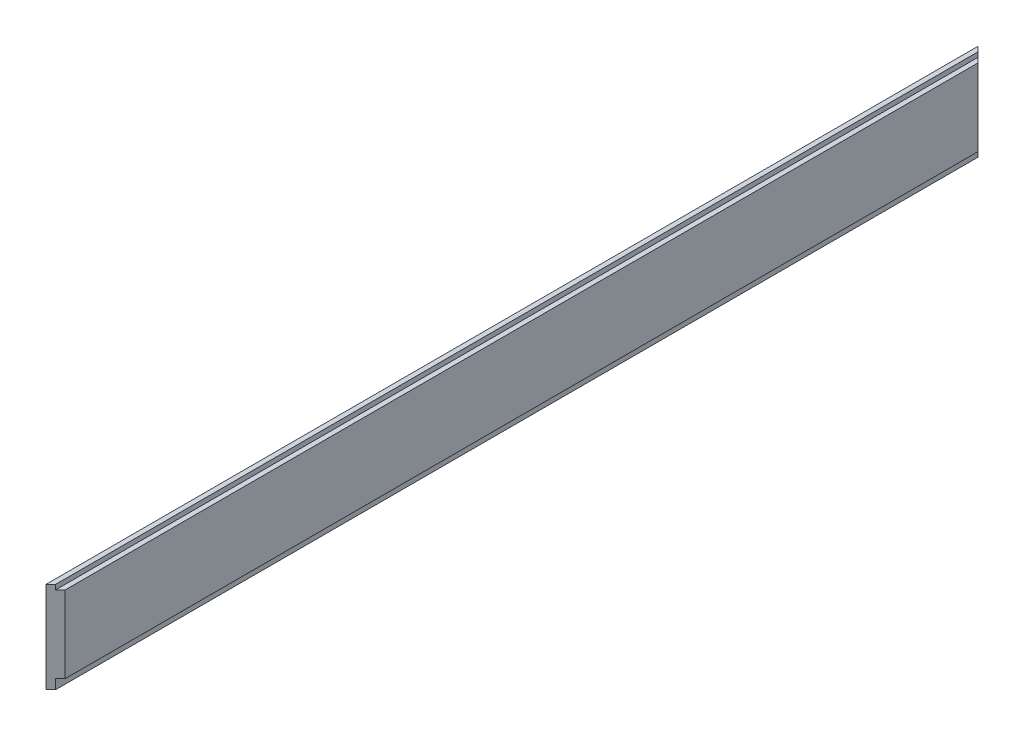
ISO-10303-21;
HEADER;
FILE_DESCRIPTION(('STEP AP214'),'2;1');
FILE_NAME('part.step','',(''),(''),'','','');
FILE_SCHEMA(('AUTOMOTIVE_DESIGN { 1 0 10303 214 1 1 1 1 }'));
ENDSEC;
DATA;
#1=APPLICATION_CONTEXT('core data for automotive mechanical design processes');
#2=APPLICATION_PROTOCOL_DEFINITION('international standard','automotive_design',2000,#1);
#3=PRODUCT_CONTEXT('',#1,'mechanical');
#4=PRODUCT('Part','Part','',(#3));
#5=PRODUCT_RELATED_PRODUCT_CATEGORY('part','',(#4));
#6=PRODUCT_DEFINITION_FORMATION('','',#4);
#7=PRODUCT_DEFINITION_CONTEXT('part definition',#1,'design');
#8=PRODUCT_DEFINITION('design','',#6,#7);
#9=PRODUCT_DEFINITION_SHAPE('','',#8);
#10=(LENGTH_UNIT() NAMED_UNIT(*) SI_UNIT(.MILLI.,.METRE.));
#11=(NAMED_UNIT(*) PLANE_ANGLE_UNIT() SI_UNIT($,.RADIAN.));
#12=(NAMED_UNIT(*) SI_UNIT($,.STERADIAN.) SOLID_ANGLE_UNIT());
#13=UNCERTAINTY_MEASURE_WITH_UNIT(LENGTH_MEASURE(1.E-05),#10,'distance_accuracy_value','');
#14=(GEOMETRIC_REPRESENTATION_CONTEXT(3) GLOBAL_UNCERTAINTY_ASSIGNED_CONTEXT((#13)) GLOBAL_UNIT_ASSIGNED_CONTEXT((#10,
#11,#12)) REPRESENTATION_CONTEXT('',''));
#15=CARTESIAN_POINT('',(0.,0.,0.));
#16=DIRECTION('',(0.,0.,1.));
#17=DIRECTION('',(1.,0.,0.));
#18=AXIS2_PLACEMENT_3D('',#15,#16,#17);
#19=CARTESIAN_POINT('',(3.175,0.,615.95));
#20=DIRECTION('',(0.,-1.,0.));
#21=DIRECTION('',(1.,0.,0.));
#22=AXIS2_PLACEMENT_3D('',#19,#20,#21);
#23=PLANE('',#22);
#24=DIRECTION('',(0.,0.,-1.));
#25=VECTOR('',#24,1.);
#26=CARTESIAN_POINT('',(3.175,0.,615.95));
#27=LINE('',#26,#25);
#28=CARTESIAN_POINT('',(3.175,0.,612.775));
#29=VERTEX_POINT('',#28);
#30=CARTESIAN_POINT('',(3.17499999999998,0.,3.17499999999995));
#31=VERTEX_POINT('',#30);
#32=EDGE_CURVE('E11',#29,#31,#27,.T.);
#33=ORIENTED_EDGE('',*,*,#32,.F.);
#34=DIRECTION('',(0.707106781186547,0.,-0.707106781186548));
#35=VECTOR('',#34,1.);
#36=CARTESIAN_POINT('',(6.34999999999999,0.,609.6));
#37=LINE('',#36,#35);
#38=CARTESIAN_POINT('',(0.,0.,615.95));
#39=VERTEX_POINT('',#38);
#40=EDGE_CURVE('E99',#39,#29,#37,.T.);
#41=ORIENTED_EDGE('',*,*,#40,.F.);
#42=DIRECTION('',(0.,0.,-1.));
#43=VECTOR('',#42,1.);
#44=CARTESIAN_POINT('',(0.,0.,615.95));
#45=LINE('',#44,#43);
#46=CARTESIAN_POINT('',(0.,0.,0.));
#47=VERTEX_POINT('',#46);
#48=EDGE_CURVE('E40',#39,#47,#45,.T.);
#49=ORIENTED_EDGE('',*,*,#48,.T.);
#50=DIRECTION('',(0.707106781186547,0.,0.707106781186548));
#51=VECTOR('',#50,1.);
#52=CARTESIAN_POINT('',(6.34999999999999,0.,6.35));
#53=LINE('',#52,#51);
#54=EDGE_CURVE('E141',#47,#31,#53,.T.);
#55=ORIENTED_EDGE('',*,*,#54,.T.);
#56=EDGE_LOOP('',(#33,#41,#49,#55));
#57=FACE_BOUND('',#56,.T.);
#58=ADVANCED_FACE('F37',(#57),#23,.T.);
#59=CARTESIAN_POINT('',(3.175,6.35,615.95));
#60=DIRECTION('',(1.,0.,0.));
#61=DIRECTION('',(0.,1.,0.));
#62=AXIS2_PLACEMENT_3D('',#59,#60,#61);
#63=PLANE('',#62);
#64=DIRECTION('',(0.,0.,-1.));
#65=VECTOR('',#64,1.);
#66=CARTESIAN_POINT('',(3.175,6.35,615.95));
#67=LINE('',#66,#65);
#68=CARTESIAN_POINT('',(3.175,6.35,612.775));
#69=VERTEX_POINT('',#68);
#70=CARTESIAN_POINT('',(3.17500000000004,6.35,3.17499999999998));
#71=VERTEX_POINT('',#70);
#72=EDGE_CURVE('E46',#69,#71,#67,.T.);
#73=ORIENTED_EDGE('',*,*,#72,.F.);
#74=DIRECTION('',(0.,-1.,0.));
#75=VECTOR('',#74,1.);
#76=CARTESIAN_POINT('',(3.175,6.35,612.775));
#77=LINE('',#76,#75);
#78=EDGE_CURVE('E145',#69,#29,#77,.T.);
#79=ORIENTED_EDGE('',*,*,#78,.T.);
#80=ORIENTED_EDGE('',*,*,#32,.T.);
#81=DIRECTION('',(0.,-1.,0.));
#82=VECTOR('',#81,1.);
#83=CARTESIAN_POINT('',(3.175,6.34999999999996,3.17499999999993));
#84=LINE('',#83,#82);
#85=EDGE_CURVE('E125',#71,#31,#84,.T.);
#86=ORIENTED_EDGE('',*,*,#85,.F.);
#87=EDGE_LOOP('',(#73,#79,#80,#86));
#88=FACE_BOUND('',#87,.T.);
#89=ADVANCED_FACE('F183',(#88),#63,.T.);
#90=CARTESIAN_POINT('',(6.35,6.35,615.95));
#91=DIRECTION('',(0.,-1.,0.));
#92=DIRECTION('',(1.,0.,0.));
#93=AXIS2_PLACEMENT_3D('',#90,#91,#92);
#94=PLANE('',#93);
#95=DIRECTION('',(0.,0.,-1.));
#96=VECTOR('',#95,1.);
#97=CARTESIAN_POINT('',(6.35,6.35,615.95));
#98=LINE('',#97,#96);
#99=CARTESIAN_POINT('',(6.34999999999999,6.35,609.6));
#100=VERTEX_POINT('',#99);
#101=CARTESIAN_POINT('',(6.34999999999999,6.35,6.35));
#102=VERTEX_POINT('',#101);
#103=EDGE_CURVE('E122',#100,#102,#98,.T.);
#104=ORIENTED_EDGE('',*,*,#103,.F.);
#105=DIRECTION('',(-0.707106781186547,0.,0.707106781186548));
#106=VECTOR('',#105,1.);
#107=CARTESIAN_POINT('',(3.17500000000001,6.35,612.775));
#108=LINE('',#107,#106);
#109=EDGE_CURVE('E148',#100,#69,#108,.T.);
#110=ORIENTED_EDGE('',*,*,#109,.T.);
#111=ORIENTED_EDGE('',*,*,#72,.T.);
#112=DIRECTION('',(-0.707106781186547,0.,-0.707106781186548));
#113=VECTOR('',#112,1.);
#114=CARTESIAN_POINT('',(311.15,6.35000000000008,311.15));
#115=LINE('',#114,#113);
#116=EDGE_CURVE('E129',#102,#71,#115,.T.);
#117=ORIENTED_EDGE('',*,*,#116,.F.);
#118=EDGE_LOOP('',(#104,#110,#111,#117));
#119=FACE_BOUND('',#118,.T.);
#120=ADVANCED_FACE('F180',(#119),#94,.T.);
#121=CARTESIAN_POINT('',(6.34999999999999,57.15,615.95));
#122=DIRECTION('',(1.,0.,0.));
#123=DIRECTION('',(0.,1.,0.));
#124=AXIS2_PLACEMENT_3D('',#121,#122,#123);
#125=PLANE('',#124);
#126=DIRECTION('',(0.,0.,-1.));
#127=VECTOR('',#126,1.);
#128=CARTESIAN_POINT('',(6.34999999999999,57.15,615.95));
#129=LINE('',#128,#127);
#130=CARTESIAN_POINT('',(6.34999999999999,57.15,609.6));
#131=VERTEX_POINT('',#130);
#132=CARTESIAN_POINT('',(6.34999999999999,57.15,6.35));
#133=VERTEX_POINT('',#132);
#134=EDGE_CURVE('E120',#131,#133,#129,.T.);
#135=ORIENTED_EDGE('',*,*,#134,.F.);
#136=DIRECTION('',(0.,1.,0.));
#137=VECTOR('',#136,1.);
#138=CARTESIAN_POINT('',(6.34999999999999,0.,609.6));
#139=LINE('',#138,#137);
#140=EDGE_CURVE('E111',#100,#131,#139,.T.);
#141=ORIENTED_EDGE('',*,*,#140,.F.);
#142=ORIENTED_EDGE('',*,*,#103,.T.);
#143=DIRECTION('',(0.,1.,0.));
#144=VECTOR('',#143,1.);
#145=CARTESIAN_POINT('',(6.34999999999999,0.,6.35));
#146=LINE('',#145,#144);
#147=EDGE_CURVE('E138',#102,#133,#146,.T.);
#148=ORIENTED_EDGE('',*,*,#147,.T.);
#149=EDGE_LOOP('',(#135,#141,#142,#148));
#150=FACE_BOUND('',#149,.T.);
#151=ADVANCED_FACE('F175',(#150),#125,.T.);
#152=CARTESIAN_POINT('',(3.17499999999999,57.15,615.95));
#153=DIRECTION('',(0.,1.,0.));
#154=DIRECTION('',(0.,0.,1.));
#155=AXIS2_PLACEMENT_3D('',#152,#153,#154);
#156=PLANE('',#155);
#157=DIRECTION('',(0.,0.,-1.));
#158=VECTOR('',#157,1.);
#159=CARTESIAN_POINT('',(3.17499999999999,57.15,615.95));
#160=LINE('',#159,#158);
#161=CARTESIAN_POINT('',(3.17499999999999,57.15,612.775));
#162=VERTEX_POINT('',#161);
#163=CARTESIAN_POINT('',(3.17499999999999,57.15,3.17499999999993));
#164=VERTEX_POINT('',#163);
#165=EDGE_CURVE('E116',#162,#164,#160,.T.);
#166=ORIENTED_EDGE('',*,*,#165,.F.);
#167=DIRECTION('',(0.707106781186547,0.,-0.707106781186548));
#168=VECTOR('',#167,1.);
#169=CARTESIAN_POINT('',(1.58750000000001,57.15,614.3625));
#170=LINE('',#169,#168);
#171=EDGE_CURVE('E151',#162,#131,#170,.T.);
#172=ORIENTED_EDGE('',*,*,#171,.T.);
#173=ORIENTED_EDGE('',*,*,#134,.T.);
#174=DIRECTION('',(0.707106781186547,0.,0.707106781186548));
#175=VECTOR('',#174,1.);
#176=CARTESIAN_POINT('',(309.5625,57.15,309.5625));
#177=LINE('',#176,#175);
#178=EDGE_CURVE('E132',#164,#133,#177,.T.);
#179=ORIENTED_EDGE('',*,*,#178,.F.);
#180=EDGE_LOOP('',(#166,#172,#173,#179));
#181=FACE_BOUND('',#180,.T.);
#182=ADVANCED_FACE('F171',(#181),#156,.T.);
#183=CARTESIAN_POINT('',(3.17499999999999,60.325,615.95));
#184=DIRECTION('',(1.,0.,0.));
#185=DIRECTION('',(0.,1.,0.));
#186=AXIS2_PLACEMENT_3D('',#183,#184,#185);
#187=PLANE('',#186);
#188=DIRECTION('',(0.,0.,-1.));
#189=VECTOR('',#188,1.);
#190=CARTESIAN_POINT('',(3.17499999999999,60.325,615.95));
#191=LINE('',#190,#189);
#192=CARTESIAN_POINT('',(3.17500000000003,60.325,612.775));
#193=VERTEX_POINT('',#192);
#194=CARTESIAN_POINT('',(3.17499999999998,60.325,3.17499999999998));
#195=VERTEX_POINT('',#194);
#196=EDGE_CURVE('E115',#193,#195,#191,.T.);
#197=ORIENTED_EDGE('',*,*,#196,.F.);
#198=DIRECTION('',(0.,-1.,0.));
#199=VECTOR('',#198,1.);
#200=CARTESIAN_POINT('',(3.17499999999999,60.325,612.775));
#201=LINE('',#200,#199);
#202=EDGE_CURVE('E154',#193,#162,#201,.T.);
#203=ORIENTED_EDGE('',*,*,#202,.T.);
#204=ORIENTED_EDGE('',*,*,#165,.T.);
#205=DIRECTION('',(0.,-1.,0.));
#206=VECTOR('',#205,1.);
#207=CARTESIAN_POINT('',(3.17499999999999,60.3249999999999,3.17499999999993));
#208=LINE('',#207,#206);
#209=EDGE_CURVE('E135',#195,#164,#208,.T.);
#210=ORIENTED_EDGE('',*,*,#209,.F.);
#211=EDGE_LOOP('',(#197,#203,#204,#210));
#212=FACE_BOUND('',#211,.T.);
#213=ADVANCED_FACE('F164',(#212),#187,.T.);
#214=CARTESIAN_POINT('',(0.,60.325,615.95));
#215=DIRECTION('',(0.,1.,0.));
#216=DIRECTION('',(0.,0.,1.));
#217=AXIS2_PLACEMENT_3D('',#214,#215,#216);
#218=PLANE('',#217);
#219=DIRECTION('',(0.,0.,-1.));
#220=VECTOR('',#219,1.);
#221=CARTESIAN_POINT('',(0.,60.325,615.95));
#222=LINE('',#221,#220);
#223=CARTESIAN_POINT('',(0.,60.325,615.95));
#224=VERTEX_POINT('',#223);
#225=CARTESIAN_POINT('',(0.,60.325,0.));
#226=VERTEX_POINT('',#225);
#227=EDGE_CURVE('E114',#224,#226,#222,.T.);
#228=ORIENTED_EDGE('',*,*,#227,.F.);
#229=DIRECTION('',(0.707106781186547,0.,-0.707106781186548));
#230=VECTOR('',#229,1.);
#231=CARTESIAN_POINT('',(6.34999999999999,60.325,609.6));
#232=LINE('',#231,#230);
#233=EDGE_CURVE('E53',#224,#193,#232,.T.);
#234=ORIENTED_EDGE('',*,*,#233,.T.);
#235=ORIENTED_EDGE('',*,*,#196,.T.);
#236=DIRECTION('',(0.707106781186547,0.,0.707106781186548));
#237=VECTOR('',#236,1.);
#238=CARTESIAN_POINT('',(6.34999999999999,60.325,6.35));
#239=LINE('',#238,#237);
#240=EDGE_CURVE('E142',#226,#195,#239,.T.);
#241=ORIENTED_EDGE('',*,*,#240,.F.);
#242=EDGE_LOOP('',(#228,#234,#235,#241));
#243=FACE_BOUND('',#242,.T.);
#244=ADVANCED_FACE('F160',(#243),#218,.T.);
#245=CARTESIAN_POINT('',(0.,0.,615.95));
#246=DIRECTION('',(-1.,0.,0.));
#247=DIRECTION('',(0.,0.,1.));
#248=AXIS2_PLACEMENT_3D('',#245,#246,#247);
#249=PLANE('',#248);
#250=DIRECTION('',(0.,1.,0.));
#251=VECTOR('',#250,1.);
#252=CARTESIAN_POINT('',(0.,0.,0.));
#253=LINE('',#252,#251);
#254=EDGE_CURVE('E104',#47,#226,#253,.T.);
#255=ORIENTED_EDGE('',*,*,#254,.F.);
#256=ORIENTED_EDGE('',*,*,#48,.F.);
#257=DIRECTION('',(0.,1.,0.));
#258=VECTOR('',#257,1.);
#259=CARTESIAN_POINT('',(0.,0.,615.95));
#260=LINE('',#259,#258);
#261=EDGE_CURVE('E96',#39,#224,#260,.T.);
#262=ORIENTED_EDGE('',*,*,#261,.T.);
#263=ORIENTED_EDGE('',*,*,#227,.T.);
#264=EDGE_LOOP('',(#255,#256,#262,#263));
#265=FACE_BOUND('',#264,.T.);
#266=ADVANCED_FACE('F113',(#265),#249,.T.);
#267=CARTESIAN_POINT('',(6.34999999999999,0.,6.35));
#268=DIRECTION('',(-0.707106781186548,0.,0.707106781186547));
#269=DIRECTION('',(0.707106781186547,0.,0.707106781186548));
#270=AXIS2_PLACEMENT_3D('',#267,#268,#269);
#271=PLANE('',#270);
#272=ORIENTED_EDGE('',*,*,#85,.T.);
#273=ORIENTED_EDGE('',*,*,#54,.F.);
#274=ORIENTED_EDGE('',*,*,#254,.T.);
#275=ORIENTED_EDGE('',*,*,#240,.T.);
#276=ORIENTED_EDGE('',*,*,#209,.T.);
#277=ORIENTED_EDGE('',*,*,#178,.T.);
#278=ORIENTED_EDGE('',*,*,#147,.F.);
#279=ORIENTED_EDGE('',*,*,#116,.T.);
#280=EDGE_LOOP('',(#272,#273,#274,#275,#276,#277,#278,#279));
#281=FACE_BOUND('',#280,.T.);
#282=ADVANCED_FACE('F168',(#281),#271,.F.);
#283=CARTESIAN_POINT('',(6.34999999999999,0.,609.6));
#284=DIRECTION('',(0.707106781186548,0.,0.707106781186547));
#285=DIRECTION('',(0.707106781186547,0.,-0.707106781186548));
#286=AXIS2_PLACEMENT_3D('',#283,#284,#285);
#287=PLANE('',#286);
#288=ORIENTED_EDGE('',*,*,#109,.F.);
#289=ORIENTED_EDGE('',*,*,#140,.T.);
#290=ORIENTED_EDGE('',*,*,#171,.F.);
#291=ORIENTED_EDGE('',*,*,#202,.F.);
#292=ORIENTED_EDGE('',*,*,#233,.F.);
#293=ORIENTED_EDGE('',*,*,#261,.F.);
#294=ORIENTED_EDGE('',*,*,#40,.T.);
#295=ORIENTED_EDGE('',*,*,#78,.F.);
#296=EDGE_LOOP('',(#288,#289,#290,#291,#292,#293,#294,#295));
#297=FACE_BOUND('',#296,.T.);
#298=ADVANCED_FACE('F98',(#297),#287,.T.);
#299=CLOSED_SHELL('',(#58,#89,#120,#151,#182,#213,#244,#266,#282,#298));
#300=MANIFOLD_SOLID_BREP('B2',#299);
#301=ADVANCED_BREP_SHAPE_REPRESENTATION('',(#18,#300),#14);
#302=SHAPE_DEFINITION_REPRESENTATION(#9,#301);
ENDSEC;
END-ISO-10303-21;
